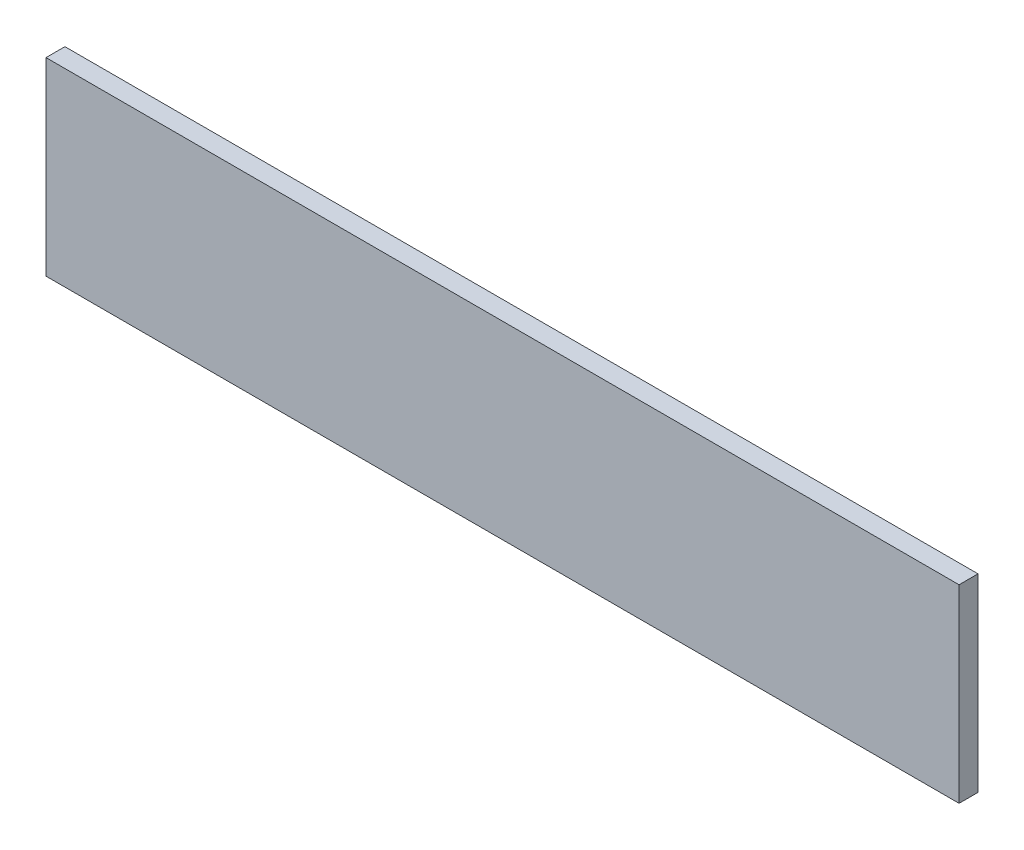
ISO-10303-21;
HEADER;
FILE_DESCRIPTION(('STEP AP214'),'2;1');
FILE_NAME('part.step','',(''),(''),'','','');
FILE_SCHEMA(('AUTOMOTIVE_DESIGN { 1 0 10303 214 1 1 1 1 }'));
ENDSEC;
DATA;
#1=APPLICATION_CONTEXT('core data for automotive mechanical design processes');
#2=APPLICATION_PROTOCOL_DEFINITION('international standard','automotive_design',2000,#1);
#3=PRODUCT_CONTEXT('',#1,'mechanical');
#4=PRODUCT('Part','Part','',(#3));
#5=PRODUCT_RELATED_PRODUCT_CATEGORY('part','',(#4));
#6=PRODUCT_DEFINITION_FORMATION('','',#4);
#7=PRODUCT_DEFINITION_CONTEXT('part definition',#1,'design');
#8=PRODUCT_DEFINITION('design','',#6,#7);
#9=PRODUCT_DEFINITION_SHAPE('','',#8);
#10=(LENGTH_UNIT() NAMED_UNIT(*) SI_UNIT(.MILLI.,.METRE.));
#11=(NAMED_UNIT(*) PLANE_ANGLE_UNIT() SI_UNIT($,.RADIAN.));
#12=(NAMED_UNIT(*) SI_UNIT($,.STERADIAN.) SOLID_ANGLE_UNIT());
#13=UNCERTAINTY_MEASURE_WITH_UNIT(LENGTH_MEASURE(1.E-05),#10,'distance_accuracy_value','');
#14=(GEOMETRIC_REPRESENTATION_CONTEXT(3) GLOBAL_UNCERTAINTY_ASSIGNED_CONTEXT((#13)) GLOBAL_UNIT_ASSIGNED_CONTEXT((#10,
#11,#12)) REPRESENTATION_CONTEXT('',''));
#15=CARTESIAN_POINT('',(0.,0.,0.));
#16=DIRECTION('',(0.,0.,1.));
#17=DIRECTION('',(1.,0.,0.));
#18=AXIS2_PLACEMENT_3D('',#15,#16,#17);
#19=CARTESIAN_POINT('',(48.23,0.,1.));
#20=DIRECTION('',(0.,1.,0.));
#21=DIRECTION('',(0.,0.,1.));
#22=AXIS2_PLACEMENT_3D('',#19,#20,#21);
#23=PLANE('',#22);
#24=DIRECTION('',(1.,0.,0.));
#25=VECTOR('',#24,1.);
#26=CARTESIAN_POINT('',(48.23,0.,0.));
#27=LINE('',#26,#25);
#28=CARTESIAN_POINT('',(0.,0.,0.));
#29=VERTEX_POINT('',#28);
#30=CARTESIAN_POINT('',(48.23,0.,0.));
#31=VERTEX_POINT('',#30);
#32=EDGE_CURVE('E96',#29,#31,#27,.T.);
#33=ORIENTED_EDGE('',*,*,#32,.T.);
#34=DIRECTION('',(0.,0.,-1.));
#35=VECTOR('',#34,1.);
#36=CARTESIAN_POINT('',(48.23,0.,1.));
#37=LINE('',#36,#35);
#38=CARTESIAN_POINT('',(48.23,0.,1.));
#39=VERTEX_POINT('',#38);
#40=EDGE_CURVE('E11',#39,#31,#37,.T.);
#41=ORIENTED_EDGE('',*,*,#40,.F.);
#42=DIRECTION('',(1.,0.,0.));
#43=VECTOR('',#42,1.);
#44=CARTESIAN_POINT('',(48.23,0.,1.));
#45=LINE('',#44,#43);
#46=CARTESIAN_POINT('',(0.,0.,1.));
#47=VERTEX_POINT('',#46);
#48=EDGE_CURVE('E84',#47,#39,#45,.T.);
#49=ORIENTED_EDGE('',*,*,#48,.F.);
#50=DIRECTION('',(0.,0.,-1.));
#51=VECTOR('',#50,1.);
#52=CARTESIAN_POINT('',(0.,0.,1.));
#53=LINE('',#52,#51);
#54=EDGE_CURVE('E92',#47,#29,#53,.T.);
#55=ORIENTED_EDGE('',*,*,#54,.T.);
#56=EDGE_LOOP('',(#33,#41,#49,#55));
#57=FACE_BOUND('',#56,.T.);
#58=ADVANCED_FACE('F33',(#57),#23,.F.);
#59=CARTESIAN_POINT('',(48.23,10.,1.));
#60=DIRECTION('',(-1.,0.,0.));
#61=DIRECTION('',(0.,0.,1.));
#62=AXIS2_PLACEMENT_3D('',#59,#60,#61);
#63=PLANE('',#62);
#64=DIRECTION('',(0.,1.,0.));
#65=VECTOR('',#64,1.);
#66=CARTESIAN_POINT('',(48.23,10.,0.));
#67=LINE('',#66,#65);
#68=CARTESIAN_POINT('',(48.23,10.,0.));
#69=VERTEX_POINT('',#68);
#70=EDGE_CURVE('E88',#31,#69,#67,.T.);
#71=ORIENTED_EDGE('',*,*,#70,.T.);
#72=DIRECTION('',(0.,0.,-1.));
#73=VECTOR('',#72,1.);
#74=CARTESIAN_POINT('',(48.23,10.,1.));
#75=LINE('',#74,#73);
#76=CARTESIAN_POINT('',(48.23,10.,1.));
#77=VERTEX_POINT('',#76);
#78=EDGE_CURVE('E41',#77,#69,#75,.T.);
#79=ORIENTED_EDGE('',*,*,#78,.F.);
#80=DIRECTION('',(0.,1.,0.));
#81=VECTOR('',#80,1.);
#82=CARTESIAN_POINT('',(48.23,10.,1.));
#83=LINE('',#82,#81);
#84=EDGE_CURVE('E79',#39,#77,#83,.T.);
#85=ORIENTED_EDGE('',*,*,#84,.F.);
#86=ORIENTED_EDGE('',*,*,#40,.T.);
#87=EDGE_LOOP('',(#71,#79,#85,#86));
#88=FACE_BOUND('',#87,.T.);
#89=ADVANCED_FACE('F87',(#88),#63,.F.);
#90=CARTESIAN_POINT('',(0.,10.,1.));
#91=DIRECTION('',(0.,-1.,0.));
#92=DIRECTION('',(0.,0.,-1.));
#93=AXIS2_PLACEMENT_3D('',#90,#91,#92);
#94=PLANE('',#93);
#95=DIRECTION('',(-1.,0.,0.));
#96=VECTOR('',#95,1.);
#97=CARTESIAN_POINT('',(0.,10.,0.));
#98=LINE('',#97,#96);
#99=CARTESIAN_POINT('',(0.,10.,0.));
#100=VERTEX_POINT('',#99);
#101=EDGE_CURVE('E66',#69,#100,#98,.T.);
#102=ORIENTED_EDGE('',*,*,#101,.T.);
#103=DIRECTION('',(0.,0.,-1.));
#104=VECTOR('',#103,1.);
#105=CARTESIAN_POINT('',(0.,10.,1.));
#106=LINE('',#105,#104);
#107=CARTESIAN_POINT('',(0.,10.,1.));
#108=VERTEX_POINT('',#107);
#109=EDGE_CURVE('E89',#108,#100,#106,.T.);
#110=ORIENTED_EDGE('',*,*,#109,.F.);
#111=DIRECTION('',(-1.,0.,0.));
#112=VECTOR('',#111,1.);
#113=CARTESIAN_POINT('',(0.,10.,1.));
#114=LINE('',#113,#112);
#115=EDGE_CURVE('E82',#77,#108,#114,.T.);
#116=ORIENTED_EDGE('',*,*,#115,.F.);
#117=ORIENTED_EDGE('',*,*,#78,.T.);
#118=EDGE_LOOP('',(#102,#110,#116,#117));
#119=FACE_BOUND('',#118,.T.);
#120=ADVANCED_FACE('F90',(#119),#94,.F.);
#121=CARTESIAN_POINT('',(0.,0.,1.));
#122=DIRECTION('',(1.,0.,0.));
#123=DIRECTION('',(0.,0.,-1.));
#124=AXIS2_PLACEMENT_3D('',#121,#122,#123);
#125=PLANE('',#124);
#126=DIRECTION('',(0.,-1.,0.));
#127=VECTOR('',#126,1.);
#128=CARTESIAN_POINT('',(0.,0.,0.));
#129=LINE('',#128,#127);
#130=EDGE_CURVE('E72',#100,#29,#129,.T.);
#131=ORIENTED_EDGE('',*,*,#130,.T.);
#132=ORIENTED_EDGE('',*,*,#54,.F.);
#133=DIRECTION('',(0.,-1.,0.));
#134=VECTOR('',#133,1.);
#135=CARTESIAN_POINT('',(0.,0.,1.));
#136=LINE('',#135,#134);
#137=EDGE_CURVE('E49',#108,#47,#136,.T.);
#138=ORIENTED_EDGE('',*,*,#137,.F.);
#139=ORIENTED_EDGE('',*,*,#109,.T.);
#140=EDGE_LOOP('',(#131,#132,#138,#139));
#141=FACE_BOUND('',#140,.T.);
#142=ADVANCED_FACE('F103',(#141),#125,.F.);
#143=CARTESIAN_POINT('',(0.,0.,1.));
#144=DIRECTION('',(0.,0.,-1.));
#145=DIRECTION('',(-1.,0.,0.));
#146=AXIS2_PLACEMENT_3D('',#143,#144,#145);
#147=PLANE('',#146);
#148=ORIENTED_EDGE('',*,*,#48,.T.);
#149=ORIENTED_EDGE('',*,*,#84,.T.);
#150=ORIENTED_EDGE('',*,*,#115,.T.);
#151=ORIENTED_EDGE('',*,*,#137,.T.);
#152=EDGE_LOOP('',(#148,#149,#150,#151));
#153=FACE_BOUND('',#152,.T.);
#154=ADVANCED_FACE('F80',(#153),#147,.F.);
#155=CARTESIAN_POINT('',(0.,0.,0.));
#156=DIRECTION('',(0.,0.,-1.));
#157=DIRECTION('',(-1.,0.,0.));
#158=AXIS2_PLACEMENT_3D('',#155,#156,#157);
#159=PLANE('',#158);
#160=ORIENTED_EDGE('',*,*,#32,.F.);
#161=ORIENTED_EDGE('',*,*,#130,.F.);
#162=ORIENTED_EDGE('',*,*,#101,.F.);
#163=ORIENTED_EDGE('',*,*,#70,.F.);
#164=EDGE_LOOP('',(#160,#161,#162,#163));
#165=FACE_BOUND('',#164,.T.);
#166=ADVANCED_FACE('F106',(#165),#159,.T.);
#167=CLOSED_SHELL('',(#58,#89,#120,#142,#154,#166));
#168=MANIFOLD_SOLID_BREP('B2',#167);
#169=ADVANCED_BREP_SHAPE_REPRESENTATION('',(#18,#168),#14);
#170=SHAPE_DEFINITION_REPRESENTATION(#9,#169);
ENDSEC;
END-ISO-10303-21;
